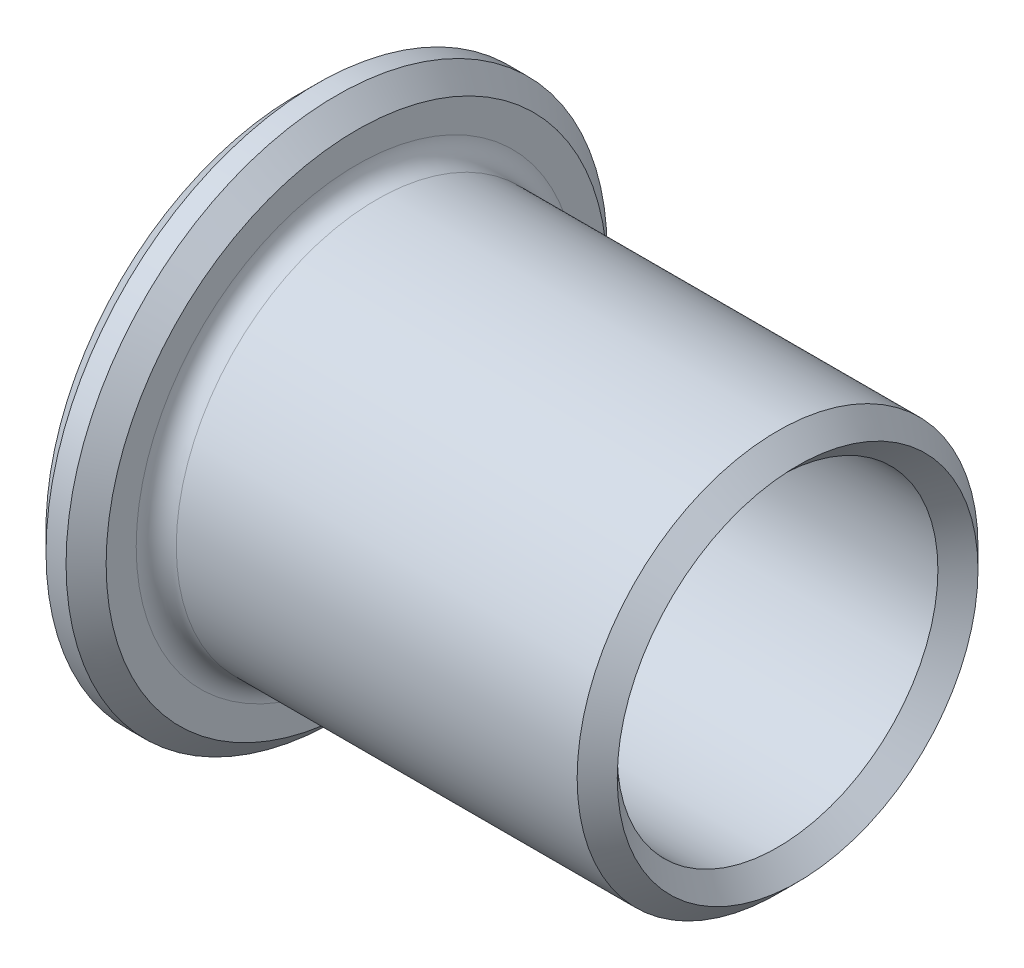
ISO-10303-21;
HEADER;
FILE_DESCRIPTION(('STEP AP214'),'2;1');
FILE_NAME('part.step','',(''),(''),'','','');
FILE_SCHEMA(('AUTOMOTIVE_DESIGN { 1 0 10303 214 1 1 1 1 }'));
ENDSEC;
DATA;
#1=APPLICATION_CONTEXT('core data for automotive mechanical design processes');
#2=APPLICATION_PROTOCOL_DEFINITION('international standard','automotive_design',2000,#1);
#3=PRODUCT_CONTEXT('',#1,'mechanical');
#4=PRODUCT('Part','Part','',(#3));
#5=PRODUCT_RELATED_PRODUCT_CATEGORY('part','',(#4));
#6=PRODUCT_DEFINITION_FORMATION('','',#4);
#7=PRODUCT_DEFINITION_CONTEXT('part definition',#1,'design');
#8=PRODUCT_DEFINITION('design','',#6,#7);
#9=PRODUCT_DEFINITION_SHAPE('','',#8);
#10=(LENGTH_UNIT() NAMED_UNIT(*) SI_UNIT(.MILLI.,.METRE.));
#11=(NAMED_UNIT(*) PLANE_ANGLE_UNIT() SI_UNIT($,.RADIAN.));
#12=(NAMED_UNIT(*) SI_UNIT($,.STERADIAN.) SOLID_ANGLE_UNIT());
#13=UNCERTAINTY_MEASURE_WITH_UNIT(LENGTH_MEASURE(1.E-05),#10,'distance_accuracy_value','');
#14=(GEOMETRIC_REPRESENTATION_CONTEXT(3) GLOBAL_UNCERTAINTY_ASSIGNED_CONTEXT((#13)) GLOBAL_UNIT_ASSIGNED_CONTEXT((#10,
#11,#12)) REPRESENTATION_CONTEXT('',''));
#15=CARTESIAN_POINT('',(0.,0.,0.));
#16=DIRECTION('',(0.,0.,1.));
#17=DIRECTION('',(1.,0.,0.));
#18=AXIS2_PLACEMENT_3D('',#15,#16,#17);
#19=CARTESIAN_POINT('',(0.,13.5,0.));
#20=DIRECTION('',(1.,0.,0.));
#21=DIRECTION('',(0.,0.,-1.));
#22=AXIS2_PLACEMENT_3D('',#19,#20,#21);
#23=PLANE('',#22);
#24=CARTESIAN_POINT('',(0.,0.,0.));
#25=DIRECTION('',(1.,0.,0.));
#26=DIRECTION('',(0.,0.,-1.));
#27=AXIS2_PLACEMENT_3D('',#24,#25,#26);
#28=CIRCLE('',#27,9.00000000000001);
#29=CARTESIAN_POINT('',(0.,0.,-9.00000000000001));
#30=VERTEX_POINT('',#29);
#31=EDGE_CURVE('E74',#30,#30,#28,.T.);
#32=ORIENTED_EDGE('',*,*,#31,.T.);
#33=EDGE_LOOP('',(#32));
#34=FACE_BOUND('',#33,.T.);
#35=CARTESIAN_POINT('',(0.,0.,0.));
#36=DIRECTION('',(1.,0.,0.));
#37=DIRECTION('',(0.,0.,-1.));
#38=AXIS2_PLACEMENT_3D('',#35,#36,#37);
#39=CIRCLE('',#38,12.5);
#40=CARTESIAN_POINT('',(0.,0.,-12.5));
#41=VERTEX_POINT('',#40);
#42=EDGE_CURVE('E77',#41,#41,#39,.F.);
#43=ORIENTED_EDGE('',*,*,#42,.T.);
#44=EDGE_LOOP('',(#43));
#45=FACE_BOUND('',#44,.T.);
#46=ADVANCED_FACE('F39',(#34,#45),#23,.F.);
#47=CARTESIAN_POINT('',(0.,0.,0.));
#48=DIRECTION('',(-1.,0.,0.));
#49=DIRECTION('',(0.,0.,1.));
#50=AXIS2_PLACEMENT_3D('',#47,#48,#49);
#51=CYLINDRICAL_SURFACE('',#50,8.);
#52=CARTESIAN_POINT('',(1.00000000000001,0.,0.));
#53=DIRECTION('',(1.,0.,0.));
#54=DIRECTION('',(0.,0.,-1.));
#55=AXIS2_PLACEMENT_3D('',#52,#53,#54);
#56=CIRCLE('',#55,8.);
#57=CARTESIAN_POINT('',(1.00000000000001,0.,-8.));
#58=VERTEX_POINT('',#57);
#59=EDGE_CURVE('E80',#58,#58,#56,.F.);
#60=ORIENTED_EDGE('',*,*,#59,.T.);
#61=EDGE_LOOP('',(#60));
#62=FACE_BOUND('',#61,.T.);
#63=CARTESIAN_POINT('',(24.,0.,0.));
#64=DIRECTION('',(-1.,0.,0.));
#65=DIRECTION('',(0.,0.,1.));
#66=AXIS2_PLACEMENT_3D('',#63,#64,#65);
#67=CIRCLE('',#66,8.);
#68=CARTESIAN_POINT('',(24.,0.,8.));
#69=VERTEX_POINT('',#68);
#70=EDGE_CURVE('E61',#69,#69,#67,.F.);
#71=ORIENTED_EDGE('',*,*,#70,.T.);
#72=EDGE_LOOP('',(#71));
#73=FACE_BOUND('',#72,.T.);
#74=ADVANCED_FACE('F86',(#62,#73),#51,.F.);
#75=CARTESIAN_POINT('',(0.,0.,0.));
#76=DIRECTION('',(-1.,0.,0.));
#77=DIRECTION('',(0.,0.,1.));
#78=AXIS2_PLACEMENT_3D('',#75,#76,#77);
#79=CYLINDRICAL_SURFACE('',#78,10.);
#80=CARTESIAN_POINT('',(4.,0.,0.));
#81=DIRECTION('',(-1.,0.,0.));
#82=DIRECTION('',(0.,0.,1.));
#83=AXIS2_PLACEMENT_3D('',#80,#81,#82);
#84=CIRCLE('',#83,10.);
#85=CARTESIAN_POINT('',(4.,0.,10.));
#86=VERTEX_POINT('',#85);
#87=EDGE_CURVE('E10',#86,#86,#84,.F.);
#88=ORIENTED_EDGE('',*,*,#87,.T.);
#89=EDGE_LOOP('',(#88));
#90=FACE_BOUND('',#89,.T.);
#91=CARTESIAN_POINT('',(24.,0.,0.));
#92=DIRECTION('',(-1.,0.,0.));
#93=DIRECTION('',(0.,0.,1.));
#94=AXIS2_PLACEMENT_3D('',#91,#92,#93);
#95=CIRCLE('',#94,10.);
#96=CARTESIAN_POINT('',(24.,0.,10.));
#97=VERTEX_POINT('',#96);
#98=EDGE_CURVE('E50',#97,#97,#95,.T.);
#99=ORIENTED_EDGE('',*,*,#98,.T.);
#100=EDGE_LOOP('',(#99));
#101=FACE_BOUND('',#100,.T.);
#102=ADVANCED_FACE('F114',(#90,#101),#79,.T.);
#103=CARTESIAN_POINT('',(3.,10.,0.));
#104=DIRECTION('',(-1.,0.,0.));
#105=DIRECTION('',(0.,0.,1.));
#106=AXIS2_PLACEMENT_3D('',#103,#104,#105);
#107=PLANE('',#106);
#108=CARTESIAN_POINT('',(3.,0.,0.));
#109=DIRECTION('',(-1.,0.,0.));
#110=DIRECTION('',(0.,0.,1.));
#111=AXIS2_PLACEMENT_3D('',#108,#109,#110);
#112=CIRCLE('',#111,11.);
#113=CARTESIAN_POINT('',(3.,0.,11.));
#114=VERTEX_POINT('',#113);
#115=EDGE_CURVE('E46',#114,#114,#112,.T.);
#116=ORIENTED_EDGE('',*,*,#115,.T.);
#117=EDGE_LOOP('',(#116));
#118=FACE_BOUND('',#117,.T.);
#119=CARTESIAN_POINT('',(3.,0.,0.));
#120=DIRECTION('',(-1.,0.,0.));
#121=DIRECTION('',(0.,0.,1.));
#122=AXIS2_PLACEMENT_3D('',#119,#120,#121);
#123=CIRCLE('',#122,12.5);
#124=CARTESIAN_POINT('',(3.,0.,12.5));
#125=VERTEX_POINT('',#124);
#126=EDGE_CURVE('E55',#125,#125,#123,.F.);
#127=ORIENTED_EDGE('',*,*,#126,.T.);
#128=EDGE_LOOP('',(#127));
#129=FACE_BOUND('',#128,.T.);
#130=ADVANCED_FACE('F121',(#118,#129),#107,.F.);
#131=CARTESIAN_POINT('',(0.,0.,0.));
#132=DIRECTION('',(-1.,0.,0.));
#133=DIRECTION('',(0.,0.,1.));
#134=AXIS2_PLACEMENT_3D('',#131,#132,#133);
#135=CYLINDRICAL_SURFACE('',#134,13.5);
#136=CARTESIAN_POINT('',(2.,0.,0.));
#137=DIRECTION('',(-1.,0.,0.));
#138=DIRECTION('',(0.,0.,1.));
#139=AXIS2_PLACEMENT_3D('',#136,#137,#138);
#140=CIRCLE('',#139,13.5);
#141=CARTESIAN_POINT('',(2.,0.,13.5));
#142=VERTEX_POINT('',#141);
#143=EDGE_CURVE('E66',#142,#142,#140,.T.);
#144=ORIENTED_EDGE('',*,*,#143,.T.);
#145=EDGE_LOOP('',(#144));
#146=FACE_BOUND('',#145,.T.);
#147=CARTESIAN_POINT('',(1.,0.,0.));
#148=DIRECTION('',(1.,0.,0.));
#149=DIRECTION('',(0.,0.,-1.));
#150=AXIS2_PLACEMENT_3D('',#147,#148,#149);
#151=CIRCLE('',#150,13.5);
#152=CARTESIAN_POINT('',(1.,0.,-13.5));
#153=VERTEX_POINT('',#152);
#154=EDGE_CURVE('E70',#153,#153,#151,.T.);
#155=ORIENTED_EDGE('',*,*,#154,.T.);
#156=EDGE_LOOP('',(#155));
#157=FACE_BOUND('',#156,.T.);
#158=ADVANCED_FACE('F103',(#146,#157),#135,.T.);
#159=CARTESIAN_POINT('',(1.00000000000001,0.,0.));
#160=DIRECTION('',(-1.,0.,0.));
#161=DIRECTION('',(0.,0.,1.));
#162=AXIS2_PLACEMENT_3D('',#159,#160,#161);
#163=CONICAL_SURFACE('',#162,8.,0.785398163397452);
#164=ORIENTED_EDGE('',*,*,#31,.F.);
#165=EDGE_LOOP('',(#164));
#166=FACE_BOUND('',#165,.T.);
#167=ORIENTED_EDGE('',*,*,#59,.F.);
#168=EDGE_LOOP('',(#167));
#169=FACE_BOUND('',#168,.T.);
#170=ADVANCED_FACE('F97',(#166,#169),#163,.F.);
#171=CARTESIAN_POINT('',(24.,0.,0.));
#172=DIRECTION('',(-1.,0.,0.));
#173=DIRECTION('',(0.,0.,1.));
#174=AXIS2_PLACEMENT_3D('',#171,#172,#173);
#175=CONICAL_SURFACE('',#174,10.,0.785398163397452);
#176=ORIENTED_EDGE('',*,*,#98,.F.);
#177=EDGE_LOOP('',(#176));
#178=FACE_BOUND('',#177,.T.);
#179=CARTESIAN_POINT('',(25.,0.,0.));
#180=DIRECTION('',(-1.,0.,0.));
#181=DIRECTION('',(0.,0.,1.));
#182=AXIS2_PLACEMENT_3D('',#179,#180,#181);
#183=CIRCLE('',#182,9.);
#184=CARTESIAN_POINT('',(25.,0.,9.));
#185=VERTEX_POINT('',#184);
#186=EDGE_CURVE('E58',#185,#185,#183,.F.);
#187=ORIENTED_EDGE('',*,*,#186,.F.);
#188=EDGE_LOOP('',(#187));
#189=FACE_BOUND('',#188,.T.);
#190=ADVANCED_FACE('F92',(#178,#189),#175,.T.);
#191=CARTESIAN_POINT('',(25.,0.,0.));
#192=DIRECTION('',(1.,0.,0.));
#193=DIRECTION('',(0.,0.,-1.));
#194=AXIS2_PLACEMENT_3D('',#191,#192,#193);
#195=CONICAL_SURFACE('',#194,9.00000000000001,0.785398163397448);
#196=ORIENTED_EDGE('',*,*,#70,.F.);
#197=EDGE_LOOP('',(#196));
#198=FACE_BOUND('',#197,.T.);
#199=ORIENTED_EDGE('',*,*,#186,.T.);
#200=EDGE_LOOP('',(#199));
#201=FACE_BOUND('',#200,.T.);
#202=ADVANCED_FACE('F88',(#198,#201),#195,.F.);
#203=CARTESIAN_POINT('',(2.,0.,0.));
#204=DIRECTION('',(-1.,0.,0.));
#205=DIRECTION('',(0.,0.,1.));
#206=AXIS2_PLACEMENT_3D('',#203,#204,#205);
#207=CONICAL_SURFACE('',#206,13.5,0.785398163397449);
#208=ORIENTED_EDGE('',*,*,#126,.F.);
#209=EDGE_LOOP('',(#208));
#210=FACE_BOUND('',#209,.T.);
#211=ORIENTED_EDGE('',*,*,#143,.F.);
#212=EDGE_LOOP('',(#211));
#213=FACE_BOUND('',#212,.T.);
#214=ADVANCED_FACE('F91',(#210,#213),#207,.T.);
#215=CARTESIAN_POINT('',(0.,0.,0.));
#216=DIRECTION('',(1.,0.,0.));
#217=DIRECTION('',(0.,0.,-1.));
#218=AXIS2_PLACEMENT_3D('',#215,#216,#217);
#219=CONICAL_SURFACE('',#218,12.5,0.785398163397449);
#220=ORIENTED_EDGE('',*,*,#154,.F.);
#221=EDGE_LOOP('',(#220));
#222=FACE_BOUND('',#221,.T.);
#223=ORIENTED_EDGE('',*,*,#42,.F.);
#224=EDGE_LOOP('',(#223));
#225=FACE_BOUND('',#224,.T.);
#226=ADVANCED_FACE('F132',(#222,#225),#219,.T.);
#227=CARTESIAN_POINT('',(4.,0.,0.));
#228=DIRECTION('',(-1.,0.,0.));
#229=DIRECTION('',(0.,0.,1.));
#230=AXIS2_PLACEMENT_3D('',#227,#228,#229);
#231=TOROIDAL_SURFACE('',#230,11.,1.);
#232=ORIENTED_EDGE('',*,*,#87,.F.);
#233=EDGE_LOOP('',(#232));
#234=FACE_BOUND('',#233,.T.);
#235=ORIENTED_EDGE('',*,*,#115,.F.);
#236=EDGE_LOOP('',(#235));
#237=FACE_BOUND('',#236,.T.);
#238=ADVANCED_FACE('F41',(#234,#237),#231,.F.);
#239=CLOSED_SHELL('',(#46,#74,#102,#130,#158,#170,#190,#202,#214,#226,#238));
#240=MANIFOLD_SOLID_BREP('B2',#239);
#241=ADVANCED_BREP_SHAPE_REPRESENTATION('',(#18,#240),#14);
#242=SHAPE_DEFINITION_REPRESENTATION(#9,#241);
ENDSEC;
END-ISO-10303-21;
